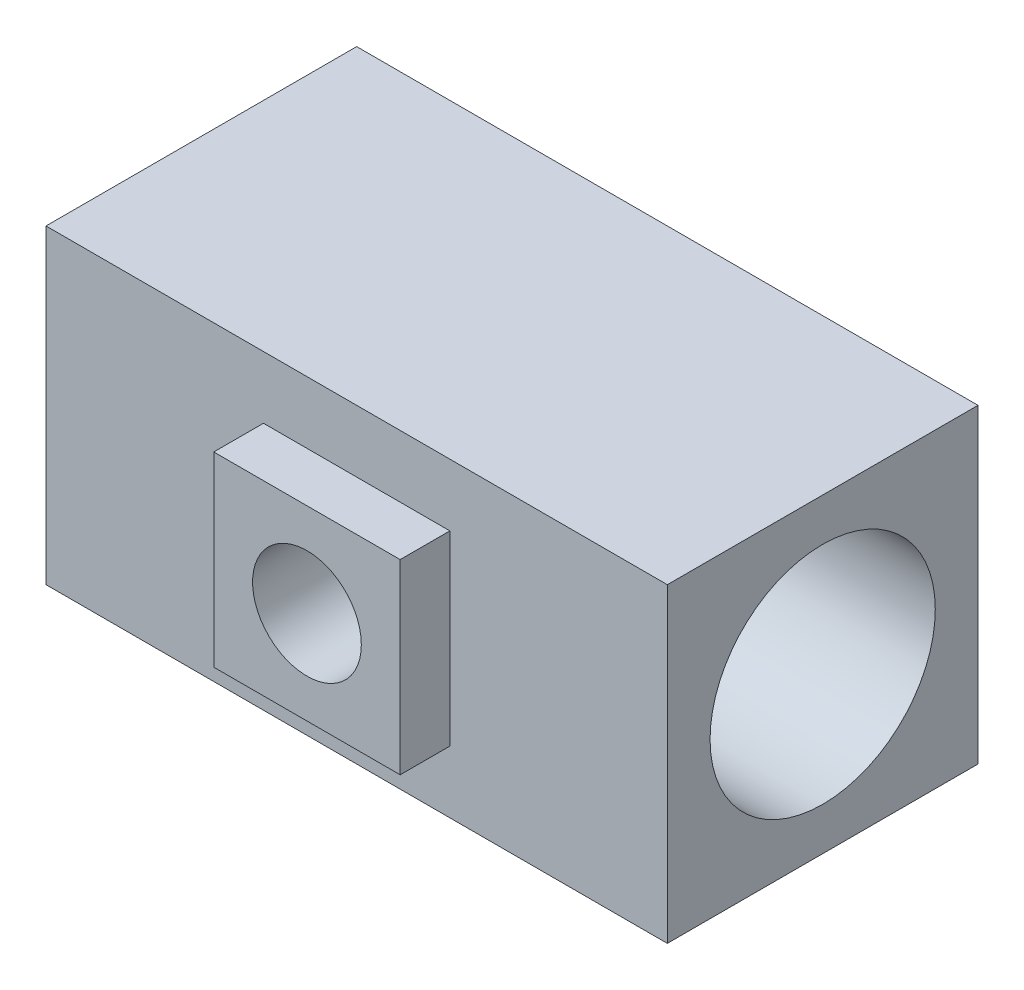
ISO-10303-21;
HEADER;
FILE_DESCRIPTION(('STEP AP214'),'2;1');
FILE_NAME('part.step','',(''),(''),'','','');
FILE_SCHEMA(('AUTOMOTIVE_DESIGN { 1 0 10303 214 1 1 1 1 }'));
ENDSEC;
DATA;
#1=APPLICATION_CONTEXT('core data for automotive mechanical design processes');
#2=APPLICATION_PROTOCOL_DEFINITION('international standard','automotive_design',2000,#1);
#3=PRODUCT_CONTEXT('',#1,'mechanical');
#4=PRODUCT('Part','Part','',(#3));
#5=PRODUCT_RELATED_PRODUCT_CATEGORY('part','',(#4));
#6=PRODUCT_DEFINITION_FORMATION('','',#4);
#7=PRODUCT_DEFINITION_CONTEXT('part definition',#1,'design');
#8=PRODUCT_DEFINITION('design','',#6,#7);
#9=PRODUCT_DEFINITION_SHAPE('','',#8);
#10=(LENGTH_UNIT() NAMED_UNIT(*) SI_UNIT(.MILLI.,.METRE.));
#11=(NAMED_UNIT(*) PLANE_ANGLE_UNIT() SI_UNIT($,.RADIAN.));
#12=(NAMED_UNIT(*) SI_UNIT($,.STERADIAN.) SOLID_ANGLE_UNIT());
#13=UNCERTAINTY_MEASURE_WITH_UNIT(LENGTH_MEASURE(1.E-05),#10,'distance_accuracy_value','');
#14=(GEOMETRIC_REPRESENTATION_CONTEXT(3) GLOBAL_UNCERTAINTY_ASSIGNED_CONTEXT((#13)) GLOBAL_UNIT_ASSIGNED_CONTEXT((#10,
#11,#12)) REPRESENTATION_CONTEXT('',''));
#15=CARTESIAN_POINT('',(0.,0.,0.));
#16=DIRECTION('',(0.,0.,1.));
#17=DIRECTION('',(1.,0.,0.));
#18=AXIS2_PLACEMENT_3D('',#15,#16,#17);
#19=CARTESIAN_POINT('',(0.,31.75,15.875));
#20=DIRECTION('',(0.,0.,-1.));
#21=DIRECTION('',(-1.,0.,0.));
#22=AXIS2_PLACEMENT_3D('',#19,#20,#21);
#23=PLANE('',#22);
#24=DIRECTION('',(1.,0.,0.));
#25=VECTOR('',#24,1.);
#26=CARTESIAN_POINT('',(0.,0.,15.875));
#27=LINE('',#26,#25);
#28=CARTESIAN_POINT('',(-31.75,0.,15.875));
#29=VERTEX_POINT('',#28);
#30=CARTESIAN_POINT('',(31.75,0.,15.875));
#31=VERTEX_POINT('',#30);
#32=EDGE_CURVE('E156',#29,#31,#27,.T.);
#33=ORIENTED_EDGE('',*,*,#32,.T.);
#34=DIRECTION('',(0.,-1.,0.));
#35=VECTOR('',#34,1.);
#36=CARTESIAN_POINT('',(31.75,31.75,15.875));
#37=LINE('',#36,#35);
#38=CARTESIAN_POINT('',(31.75,31.75,15.875));
#39=VERTEX_POINT('',#38);
#40=EDGE_CURVE('E11',#39,#31,#37,.T.);
#41=ORIENTED_EDGE('',*,*,#40,.F.);
#42=DIRECTION('',(1.,0.,0.));
#43=VECTOR('',#42,1.);
#44=CARTESIAN_POINT('',(0.,31.75,15.875));
#45=LINE('',#44,#43);
#46=CARTESIAN_POINT('',(-31.75,31.75,15.875));
#47=VERTEX_POINT('',#46);
#48=EDGE_CURVE('E157',#47,#39,#45,.T.);
#49=ORIENTED_EDGE('',*,*,#48,.F.);
#50=DIRECTION('',(0.,-1.,0.));
#51=VECTOR('',#50,1.);
#52=CARTESIAN_POINT('',(-31.75,31.75,15.875));
#53=LINE('',#52,#51);
#54=EDGE_CURVE('E173',#47,#29,#53,.T.);
#55=ORIENTED_EDGE('',*,*,#54,.T.);
#56=EDGE_LOOP('',(#33,#41,#49,#55));
#57=FACE_BOUND('',#56,.T.);
#58=DIRECTION('',(1.,0.,0.));
#59=VECTOR('',#58,1.);
#60=CARTESIAN_POINT('',(0.,6.35,15.875));
#61=LINE('',#60,#59);
#62=CARTESIAN_POINT('',(-9.525,6.35,15.875));
#63=VERTEX_POINT('',#62);
#64=CARTESIAN_POINT('',(9.525,6.35,15.875));
#65=VERTEX_POINT('',#64);
#66=EDGE_CURVE('E68',#63,#65,#61,.T.);
#67=ORIENTED_EDGE('',*,*,#66,.F.);
#68=DIRECTION('',(0.,1.,0.));
#69=VECTOR('',#68,1.);
#70=CARTESIAN_POINT('',(-9.525,0.,15.875));
#71=LINE('',#70,#69);
#72=CARTESIAN_POINT('',(-9.525,25.4,15.875));
#73=VERTEX_POINT('',#72);
#74=EDGE_CURVE('E73',#63,#73,#71,.T.);
#75=ORIENTED_EDGE('',*,*,#74,.T.);
#76=DIRECTION('',(1.,0.,0.));
#77=VECTOR('',#76,1.);
#78=CARTESIAN_POINT('',(0.,25.4,15.875));
#79=LINE('',#78,#77);
#80=CARTESIAN_POINT('',(9.525,25.4,15.875));
#81=VERTEX_POINT('',#80);
#82=EDGE_CURVE('E275',#73,#81,#79,.T.);
#83=ORIENTED_EDGE('',*,*,#82,.T.);
#84=DIRECTION('',(0.,1.,0.));
#85=VECTOR('',#84,1.);
#86=CARTESIAN_POINT('',(9.525,0.,15.875));
#87=LINE('',#86,#85);
#88=EDGE_CURVE('E264',#65,#81,#87,.T.);
#89=ORIENTED_EDGE('',*,*,#88,.F.);
#90=EDGE_LOOP('',(#67,#75,#83,#89));
#91=FACE_BOUND('',#90,.T.);
#92=ADVANCED_FACE('F47',(#57,#91),#23,.F.);
#93=CARTESIAN_POINT('',(31.75,31.75,0.));
#94=DIRECTION('',(-1.,0.,0.));
#95=DIRECTION('',(0.,0.,1.));
#96=AXIS2_PLACEMENT_3D('',#93,#94,#95);
#97=PLANE('',#96);
#98=CARTESIAN_POINT('',(31.75,15.875,0.));
#99=DIRECTION('',(1.,0.,0.));
#100=DIRECTION('',(0.,0.,-1.));
#101=AXIS2_PLACEMENT_3D('',#98,#99,#100);
#102=CIRCLE('',#101,11.509375);
#103=CARTESIAN_POINT('',(31.75,15.875,-11.509375));
#104=VERTEX_POINT('',#103);
#105=EDGE_CURVE('E142',#104,#104,#102,.T.);
#106=ORIENTED_EDGE('',*,*,#105,.F.);
#107=EDGE_LOOP('',(#106));
#108=FACE_BOUND('',#107,.T.);
#109=DIRECTION('',(0.,0.,-1.));
#110=VECTOR('',#109,1.);
#111=CARTESIAN_POINT('',(31.75,0.,0.));
#112=LINE('',#111,#110);
#113=CARTESIAN_POINT('',(31.75,0.,-15.875));
#114=VERTEX_POINT('',#113);
#115=EDGE_CURVE('E177',#31,#114,#112,.T.);
#116=ORIENTED_EDGE('',*,*,#115,.T.);
#117=DIRECTION('',(0.,-1.,0.));
#118=VECTOR('',#117,1.);
#119=CARTESIAN_POINT('',(31.75,31.75,-15.875));
#120=LINE('',#119,#118);
#121=CARTESIAN_POINT('',(31.75,31.75,-15.875));
#122=VERTEX_POINT('',#121);
#123=EDGE_CURVE('E61',#122,#114,#120,.T.);
#124=ORIENTED_EDGE('',*,*,#123,.F.);
#125=DIRECTION('',(0.,0.,-1.));
#126=VECTOR('',#125,1.);
#127=CARTESIAN_POINT('',(31.75,31.75,0.));
#128=LINE('',#127,#126);
#129=EDGE_CURVE('E161',#39,#122,#128,.T.);
#130=ORIENTED_EDGE('',*,*,#129,.F.);
#131=ORIENTED_EDGE('',*,*,#40,.T.);
#132=EDGE_LOOP('',(#116,#124,#130,#131));
#133=FACE_BOUND('',#132,.T.);
#134=ADVANCED_FACE('F200',(#108,#133),#97,.F.);
#135=CARTESIAN_POINT('',(0.,31.75,-15.875));
#136=DIRECTION('',(0.,0.,-1.));
#137=DIRECTION('',(-1.,0.,0.));
#138=AXIS2_PLACEMENT_3D('',#135,#136,#137);
#139=PLANE('',#138);
#140=DIRECTION('',(1.,0.,0.));
#141=VECTOR('',#140,1.);
#142=CARTESIAN_POINT('',(0.,0.,-15.875));
#143=LINE('',#142,#141);
#144=CARTESIAN_POINT('',(-31.75,0.,-15.875));
#145=VERTEX_POINT('',#144);
#146=EDGE_CURVE('E181',#145,#114,#143,.T.);
#147=ORIENTED_EDGE('',*,*,#146,.F.);
#148=DIRECTION('',(0.,-1.,0.));
#149=VECTOR('',#148,1.);
#150=CARTESIAN_POINT('',(-31.75,31.75,-15.875));
#151=LINE('',#150,#149);
#152=CARTESIAN_POINT('',(-31.75,31.75,-15.875));
#153=VERTEX_POINT('',#152);
#154=EDGE_CURVE('E190',#153,#145,#151,.T.);
#155=ORIENTED_EDGE('',*,*,#154,.F.);
#156=DIRECTION('',(1.,0.,0.));
#157=VECTOR('',#156,1.);
#158=CARTESIAN_POINT('',(0.,31.75,-15.875));
#159=LINE('',#158,#157);
#160=EDGE_CURVE('E165',#153,#122,#159,.T.);
#161=ORIENTED_EDGE('',*,*,#160,.T.);
#162=ORIENTED_EDGE('',*,*,#123,.T.);
#163=EDGE_LOOP('',(#147,#155,#161,#162));
#164=FACE_BOUND('',#163,.T.);
#165=ADVANCED_FACE('F197',(#164),#139,.T.);
#166=CARTESIAN_POINT('',(-31.75,31.75,0.));
#167=DIRECTION('',(-1.,0.,0.));
#168=DIRECTION('',(0.,0.,1.));
#169=AXIS2_PLACEMENT_3D('',#166,#167,#168);
#170=PLANE('',#169);
#171=CARTESIAN_POINT('',(-31.75,15.875,0.));
#172=DIRECTION('',(1.,0.,0.));
#173=DIRECTION('',(0.,0.,-1.));
#174=AXIS2_PLACEMENT_3D('',#171,#172,#173);
#175=CIRCLE('',#174,11.509375);
#176=CARTESIAN_POINT('',(-31.75,15.875,-11.509375));
#177=VERTEX_POINT('',#176);
#178=EDGE_CURVE('E147',#177,#177,#175,.T.);
#179=ORIENTED_EDGE('',*,*,#178,.T.);
#180=EDGE_LOOP('',(#179));
#181=FACE_BOUND('',#180,.T.);
#182=DIRECTION('',(0.,0.,-1.));
#183=VECTOR('',#182,1.);
#184=CARTESIAN_POINT('',(-31.75,0.,0.));
#185=LINE('',#184,#183);
#186=EDGE_CURVE('E162',#29,#145,#185,.T.);
#187=ORIENTED_EDGE('',*,*,#186,.F.);
#188=ORIENTED_EDGE('',*,*,#54,.F.);
#189=DIRECTION('',(0.,0.,-1.));
#190=VECTOR('',#189,1.);
#191=CARTESIAN_POINT('',(-31.75,31.75,0.));
#192=LINE('',#191,#190);
#193=EDGE_CURVE('E169',#47,#153,#192,.T.);
#194=ORIENTED_EDGE('',*,*,#193,.T.);
#195=ORIENTED_EDGE('',*,*,#154,.T.);
#196=EDGE_LOOP('',(#187,#188,#194,#195));
#197=FACE_BOUND('',#196,.T.);
#198=ADVANCED_FACE('F207',(#181,#197),#170,.T.);
#199=CARTESIAN_POINT('',(0.,31.75,0.));
#200=DIRECTION('',(0.,1.,0.));
#201=DIRECTION('',(0.,0.,1.));
#202=AXIS2_PLACEMENT_3D('',#199,#200,#201);
#203=PLANE('',#202);
#204=ORIENTED_EDGE('',*,*,#48,.T.);
#205=ORIENTED_EDGE('',*,*,#129,.T.);
#206=ORIENTED_EDGE('',*,*,#160,.F.);
#207=ORIENTED_EDGE('',*,*,#193,.F.);
#208=EDGE_LOOP('',(#204,#205,#206,#207));
#209=FACE_BOUND('',#208,.T.);
#210=ADVANCED_FACE('F211',(#209),#203,.T.);
#211=CARTESIAN_POINT('',(0.,0.,0.));
#212=DIRECTION('',(0.,1.,0.));
#213=DIRECTION('',(0.,0.,1.));
#214=AXIS2_PLACEMENT_3D('',#211,#212,#213);
#215=PLANE('',#214);
#216=ORIENTED_EDGE('',*,*,#32,.F.);
#217=ORIENTED_EDGE('',*,*,#186,.T.);
#218=ORIENTED_EDGE('',*,*,#146,.T.);
#219=ORIENTED_EDGE('',*,*,#115,.F.);
#220=EDGE_LOOP('',(#216,#217,#218,#219));
#221=FACE_BOUND('',#220,.T.);
#222=ADVANCED_FACE('F204',(#221),#215,.F.);
#223=CARTESIAN_POINT('',(31.75,15.875,0.));
#224=DIRECTION('',(1.,0.,0.));
#225=DIRECTION('',(0.,0.,-1.));
#226=AXIS2_PLACEMENT_3D('',#223,#224,#225);
#227=CYLINDRICAL_SURFACE('',#226,11.509375);
#228=CARTESIAN_POINT('',(5.55625,15.875,11.509375));
#229=CARTESIAN_POINT('',(5.55624917670931,16.0217161827962,11.5093742745244));
#230=CARTESIAN_POINT('',(5.55043176712709,16.1684514863056,11.5065627281438));
#231=CARTESIAN_POINT('',(5.52722532965593,16.4608490918241,11.4953867994236));
#232=CARTESIAN_POINT('',(5.50983075529338,16.6065108456735,11.4870197555197));
#233=CARTESIAN_POINT('',(5.46363405768655,16.8958379508244,11.4649327836274));
#234=CARTESIAN_POINT('',(5.43481396879573,17.0394997873948,11.4512044259401));
#235=CARTESIAN_POINT('',(5.36607781282107,17.3236196089221,11.4187421982216));
#236=CARTESIAN_POINT('',(5.32615720917637,17.464076258534,11.4000062818219));
#237=CARTESIAN_POINT('',(5.23582668542856,17.7402185894981,11.3580845669973));
#238=CARTESIAN_POINT('',(5.18546202443527,17.8759219967391,11.3349180013025));
#239=CARTESIAN_POINT('',(5.0746132703954,18.1423928013823,11.2846385897472));
#240=CARTESIAN_POINT('',(5.01412537467707,18.2731583212179,11.2575242614565));
#241=CARTESIAN_POINT('',(4.81827856523361,18.6567962075089,11.171204198503));
#242=CARTESIAN_POINT('',(4.66843156311467,18.9013275978551,11.1069709761259));
#243=CARTESIAN_POINT('',(4.32480364962457,19.3762803882592,10.9668460296091));
#244=CARTESIAN_POINT('',(4.12899135252334,19.6050810049142,10.8904962139281));
#245=CARTESIAN_POINT('',(3.70310804289293,20.0281845102496,10.7362690637281));
#246=CARTESIAN_POINT('',(3.47301301976507,20.2224630098797,10.6583906921144));
#247=CARTESIAN_POINT('',(3.09706550322224,20.490856906311,10.5437185326314));
#248=CARTESIAN_POINT('',(2.96164682087579,20.5789081286492,10.5046244939838));
#249=CARTESIAN_POINT('',(2.68303969055155,20.7431956350958,10.4295026937569));
#250=CARTESIAN_POINT('',(2.53985455771173,20.8194369075664,10.3934736404844));
#251=CARTESIAN_POINT('',(2.24653350940521,20.9594287072871,10.3257132657496));
#252=CARTESIAN_POINT('',(2.0963979044515,21.023179791873,10.2939817525424));
#253=CARTESIAN_POINT('',(1.79023246616458,21.1374763177278,10.2360228975961));
#254=CARTESIAN_POINT('',(1.63420607738184,21.188029343568,10.2097923962852));
#255=CARTESIAN_POINT('',(1.32648387367507,21.2728090952795,10.1652118787826));
#256=CARTESIAN_POINT('',(1.17505356132178,21.3078063968844,10.1464959430813));
#257=CARTESIAN_POINT('',(0.869208860627859,21.3650433875042,10.115641263073));
#258=CARTESIAN_POINT('',(0.71479604772813,21.3872896312438,10.1034991396535));
#259=CARTESIAN_POINT('',(0.40433100232894,21.4187137561491,10.0862913659061));
#260=CARTESIAN_POINT('',(0.248279649045267,21.4278983178002,10.0812220981435));
#261=CARTESIAN_POINT('',(-0.0641021623082889,21.4330753075958,10.0783690850181));
#262=CARTESIAN_POINT('',(-0.220432595712277,21.4290688489978,10.0805847248447));
#263=CARTESIAN_POINT('',(-0.514787582262235,21.4090960170049,10.0915608134673));
#264=CARTESIAN_POINT('',(-0.652935232069558,21.3944928752436,10.0995749824762));
#265=CARTESIAN_POINT('',(-0.927379883061346,21.3550644062661,10.1210232079932));
#266=CARTESIAN_POINT('',(-1.06367628328813,21.330235837873,10.134458982973));
#267=CARTESIAN_POINT('',(-1.33345991658716,21.2706348318495,10.1663158118991));
#268=CARTESIAN_POINT('',(-1.46694757494182,21.2358639114314,10.1847361051804));
#269=CARTESIAN_POINT('',(-1.73036735965916,21.1567313303141,10.225996808665));
#270=CARTESIAN_POINT('',(-1.86029807252418,21.112365917434,10.248838947781));
#271=CARTESIAN_POINT('',(-2.24952315162245,20.96320273266,10.3241730035307));
#272=CARTESIAN_POINT('',(-2.50218142559267,20.8436861921535,10.3827132068056));
#273=CARTESIAN_POINT('',(-2.98489712264919,20.5696271842136,10.5094677729022));
#274=CARTESIAN_POINT('',(-3.21494442638983,20.4150691356525,10.5776864341633));
#275=CARTESIAN_POINT('',(-3.67443472273407,20.0541711800927,10.725791278955));
#276=CARTESIAN_POINT('',(-3.90065010750817,19.8438863118393,10.8061081019085));
#277=CARTESIAN_POINT('',(-4.31596509645506,19.3877505918141,10.9628597354545));
#278=CARTESIAN_POINT('',(-4.50504920376075,19.1418849643302,11.0392929153721));
#279=CARTESIAN_POINT('',(-4.76026535090936,18.7451814958855,11.1466447726395));
#280=CARTESIAN_POINT('',(-4.84190294707575,18.6052486797592,11.1818256881973));
#281=CARTESIAN_POINT('',(-4.99297394488215,18.3180339143438,11.2480650561521));
#282=CARTESIAN_POINT('',(-5.06241245737349,18.1707550760613,11.2791252336059));
#283=CARTESIAN_POINT('',(-5.1883453158768,17.8698883876937,11.3362065187612));
#284=CARTESIAN_POINT('',(-5.24484440516823,17.7163028739094,11.3622294724437));
#285=CARTESIAN_POINT('',(-5.34425784976348,17.4039448450254,11.408459622944));
#286=CARTESIAN_POINT('',(-5.38717364828769,17.2451728829629,11.4286674375976));
#287=CARTESIAN_POINT('',(-5.45602095233257,16.9364840034257,11.4612879518407));
#288=CARTESIAN_POINT('',(-5.48302580699813,16.7868575232727,11.4741900903213));
#289=CARTESIAN_POINT('',(-5.52470046509021,16.4855151543708,11.4941627673432));
#290=CARTESIAN_POINT('',(-5.53937126096037,16.3337994347284,11.5012337750778));
#291=CARTESIAN_POINT('',(-5.55618807382354,16.0295677480296,11.5093427554344));
#292=CARTESIAN_POINT('',(-5.55833844918365,15.8770520779428,11.5103828274287));
#293=CARTESIAN_POINT('',(-5.55009766154914,15.5724426409943,11.5064055701472));
#294=CARTESIAN_POINT('',(-5.53970698297379,15.4203488580639,11.5013884748396));
#295=CARTESIAN_POINT('',(-5.50770799569872,15.1286532269732,11.4860118003834));
#296=CARTESIAN_POINT('',(-5.48695394022252,14.9889350720954,11.4760594152334));
#297=CARTESIAN_POINT('',(-5.43496904456927,14.7118566496924,11.4512953602001));
#298=CARTESIAN_POINT('',(-5.40373486504144,14.5744971484032,11.4364821415108));
#299=CARTESIAN_POINT('',(-5.33111429815479,14.3031049507264,11.4023484300071));
#300=CARTESIAN_POINT('',(-5.28973097011656,14.1690712651997,11.3830292955246));
#301=CARTESIAN_POINT('',(-5.19719866461974,13.9050665082899,11.3403262772334));
#302=CARTESIAN_POINT('',(-5.14604595046922,13.7750970136272,11.3169408384118));
#303=CARTESIAN_POINT('',(-4.97526526228489,13.3848817770465,11.2399484532559));
#304=CARTESIAN_POINT('',(-4.84043485852495,13.1322355665106,11.1805371343703));
#305=CARTESIAN_POINT('',(-4.53518458376599,12.6524131041097,11.0518139622956));
#306=CARTESIAN_POINT('',(-4.36474920052133,12.4252480202878,10.9824977979732));
#307=CARTESIAN_POINT('',(-3.97478995091778,11.9803369483628,10.83315813575));
#308=CARTESIAN_POINT('',(-3.7521764329486,11.765427289037,10.7527381857527));
#309=CARTESIAN_POINT('',(-3.27341673003243,11.3747703395995,10.5951927396217));
#310=CARTESIAN_POINT('',(-3.01725132991948,11.1990456477678,10.5180691651496));
#311=CARTESIAN_POINT('',(-2.6066293865917,10.965458575265,10.4100860394683));
#312=CARTESIAN_POINT('',(-2.46229626188337,10.891482193332,10.3747742376043));
#313=CARTESIAN_POINT('',(-2.16687413852488,10.7561201860935,10.3086590819563));
#314=CARTESIAN_POINT('',(-2.01578822507776,10.6947288811331,10.2778536962287));
#315=CARTESIAN_POINT('',(-1.7079757805328,10.5852549829649,10.221941758035));
#316=CARTESIAN_POINT('',(-1.55125357586345,10.5371624180251,10.1968309381948));
#317=CARTESIAN_POINT('',(-1.23329265055951,10.4548657207494,10.1533261373838));
#318=CARTESIAN_POINT('',(-1.0720545732824,10.4206596207178,10.134931204817));
#319=CARTESIAN_POINT('',(-0.761717566487486,10.3691774186428,10.1070471653463));
#320=CARTESIAN_POINT('',(-0.612890756313448,10.3506188374852,10.0968869227534));
#321=CARTESIAN_POINT('',(-0.313925698362231,10.3255982718127,10.0831572812686));
#322=CARTESIAN_POINT('',(-0.163787570158543,10.3191351956945,10.0795872876159));
#323=CARTESIAN_POINT('',(0.136483530582645,10.3183983480878,10.0791810483278));
#324=CARTESIAN_POINT('',(0.286616492485649,10.3241211170063,10.0823428915065));
#325=CARTESIAN_POINT('',(0.58563684120493,10.3476646599421,10.0952689889765));
#326=CARTESIAN_POINT('',(0.734524266860923,10.3654850552831,10.1050330366076));
#327=CARTESIAN_POINT('',(1.01749931869986,10.4109910872922,10.1297052039949));
#328=CARTESIAN_POINT('',(1.15178415635671,10.4377281014503,10.1441153857669));
#329=CARTESIAN_POINT('',(1.41746883751014,10.5008614763396,10.1777018617631));
#330=CARTESIAN_POINT('',(1.54886776509318,10.5372608570301,10.1968796459757));
#331=CARTESIAN_POINT('',(1.93754157022929,10.6604433169916,10.2607380055822));
#332=CARTESIAN_POINT('',(2.18947663802037,10.7612406732841,10.3117607695226));
#333=CARTESIAN_POINT('',(2.69007546576374,11.0048738554934,10.4291395000461));
#334=CARTESIAN_POINT('',(2.93738590514495,11.1500762478461,10.4962944848735));
#335=CARTESIAN_POINT('',(3.40571736098759,11.4756321473774,10.6368584817885));
#336=CARTESIAN_POINT('',(3.62672524243684,11.6560030994548,10.7102705874241));
#337=CARTESIAN_POINT('',(4.06154830948552,12.0703407406444,10.8648141713499));
#338=CARTESIAN_POINT('',(4.27188138728121,12.30802461839,10.9459039654802));
#339=CARTESIAN_POINT('',(4.55553399438264,12.6899895916608,11.0607070482151));
#340=CARTESIAN_POINT('',(4.64483792981559,12.8216710750929,11.0978641551184));
#341=CARTESIAN_POINT('',(4.81215032344455,13.0928315629359,11.1689232679138));
#342=CARTESIAN_POINT('',(4.89016397304004,13.2323069424704,11.2028267674195));
#343=CARTESIAN_POINT('',(5.03425029400513,13.5183273248093,11.2664676998002));
#344=CARTESIAN_POINT('',(5.10031478376494,13.6648770851237,11.2962022750971));
#345=CARTESIAN_POINT('',(5.21972533720667,13.9639060841525,11.3506170029584));
#346=CARTESIAN_POINT('',(5.27307762099158,14.1163823803467,11.3752996266138));
#347=CARTESIAN_POINT('',(5.36636120732754,14.4258149773538,11.4188411531494));
#348=CARTESIAN_POINT('',(5.40632276114929,14.5827602990886,11.4377131749363));
#349=CARTESIAN_POINT('',(5.47244674032604,14.9000761842849,11.4691159636703));
#350=CARTESIAN_POINT('',(5.49861796836467,15.0604444945748,11.4816507755972));
#351=CARTESIAN_POINT('',(5.53053809682022,15.330062331827,11.4969792925322));
#352=CARTESIAN_POINT('',(5.54017354912781,15.438764603652,11.5016212304839));
#353=CARTESIAN_POINT('',(5.55302988750243,15.656641046,11.5078193928603));
#354=CARTESIAN_POINT('',(5.55625061268501,15.7658152282898,11.509375539892));
#355=CARTESIAN_POINT('',(5.55625,15.875,11.509375));
#356=B_SPLINE_CURVE_WITH_KNOTS('',3,(#228,#229,#230,#231,#232,#233,#234,#235,#236,#237,#238,
#239,#240,#241,#242,#243,#244,#245,#246,#247,#248,#249,#250,#251,#252,#253,#254,#255,#256,#257,
#258,#259,#260,#261,#262,#263,#264,#265,#266,#267,#268,#269,#270,#271,#272,#273,#274,#275,#276,
#277,#278,#279,#280,#281,#282,#283,#284,#285,#286,#287,#288,#289,#290,#291,#292,#293,#294,#295,
#296,#297,#298,#299,#300,#301,#302,#303,#304,#305,#306,#307,#308,#309,#310,#311,#312,#313,#314,
#315,#316,#317,#318,#319,#320,#321,#322,#323,#324,#325,#326,#327,#328,#329,#330,#331,#332,#333,
#334,#335,#336,#337,#338,#339,#340,#341,#342,#343,#344,#345,#346,#347,#348,#349,#350,#351,#352,
#353,#354,#355),.UNSPECIFIED.,.T.,.F.,(4,2,2,2,2,2,2,2,2,2,2,2,2,2,2,2,2,2,2,2,2,2,2,2,2,2,2,2,
2,2,2,2,2,2,2,2,2,2,2,2,2,2,2,2,2,2,2,2,2,2,2,2,2,2,2,2,2,2,2,2,2,2,2,4),(0.,0.440040362554435,
0.880291694793109,1.32123804799024,1.76236487276905,2.2016186012331,2.6410377019674,
3.5188724778228,4.44720306001579,5.37618690039855,5.87423862157219,6.37207939544333,
6.86989794965314,7.36742978798151,7.8364030055191,8.30513492906855,8.77362703018528,
9.24207959387839,9.65903291521381,10.0761185010477,10.4931404731679,10.9103258286747,
11.7632747568597,12.6166036932768,13.5698940930991,14.5235815103237,15.0203733968855,
15.5169566517119,16.0133575787172,16.5097057455598,16.9668702497747,17.4239979653343,
17.8809665448997,18.3379174738513,18.7622297607783,19.186677377713,19.6109972076969,
20.0354796619695,20.9089138427864,21.7827293547615,22.7377353085697,23.6932906055866,
24.1906889846946,24.6878623909293,25.1846619867895,25.6813911621445,26.1317439144035,
26.5820560209659,27.0322402998047,27.4824104877662,27.8949694997984,28.3076576087051,
29.1324810406994,30.0126390208786,30.8932347076183,31.8709593379778,32.3606357240867,
32.8500862312346,33.3398706076821,33.8294148374232,34.3178455520473,34.8059641112104,
35.133429702592,35.4609035068655),.UNSPECIFIED.);
#357=CARTESIAN_POINT('',(5.55625,15.875,11.509375));
#358=VERTEX_POINT('',#357);
#359=EDGE_CURVE('E50',#358,#358,#356,.T.);
#360=ORIENTED_EDGE('',*,*,#359,.T.);
#361=EDGE_LOOP('',(#360));
#362=FACE_BOUND('',#361,.T.);
#363=ORIENTED_EDGE('',*,*,#178,.F.);
#364=EDGE_LOOP('',(#363));
#365=FACE_BOUND('',#364,.T.);
#366=ORIENTED_EDGE('',*,*,#105,.T.);
#367=EDGE_LOOP('',(#366));
#368=FACE_BOUND('',#367,.T.);
#369=ADVANCED_FACE('F229',(#362,#365,#368),#227,.F.);
#370=CARTESIAN_POINT('',(0.,6.35,20.955));
#371=DIRECTION('',(0.,1.,0.));
#372=DIRECTION('',(0.,0.,1.));
#373=AXIS2_PLACEMENT_3D('',#370,#371,#372);
#374=PLANE('',#373);
#375=ORIENTED_EDGE('',*,*,#66,.T.);
#376=DIRECTION('',(0.,0.,-1.));
#377=VECTOR('',#376,1.);
#378=CARTESIAN_POINT('',(9.525,6.35,20.955));
#379=LINE('',#378,#377);
#380=CARTESIAN_POINT('',(9.525,6.35,20.955));
#381=VERTEX_POINT('',#380);
#382=EDGE_CURVE('E122',#381,#65,#379,.T.);
#383=ORIENTED_EDGE('',*,*,#382,.F.);
#384=DIRECTION('',(1.,0.,0.));
#385=VECTOR('',#384,1.);
#386=CARTESIAN_POINT('',(0.,6.35,20.955));
#387=LINE('',#386,#385);
#388=CARTESIAN_POINT('',(-9.525,6.35,20.955));
#389=VERTEX_POINT('',#388);
#390=EDGE_CURVE('E130',#389,#381,#387,.T.);
#391=ORIENTED_EDGE('',*,*,#390,.F.);
#392=DIRECTION('',(0.,0.,-1.));
#393=VECTOR('',#392,1.);
#394=CARTESIAN_POINT('',(-9.525,6.35,20.955));
#395=LINE('',#394,#393);
#396=EDGE_CURVE('E271',#389,#63,#395,.T.);
#397=ORIENTED_EDGE('',*,*,#396,.T.);
#398=EDGE_LOOP('',(#375,#383,#391,#397));
#399=FACE_BOUND('',#398,.T.);
#400=ADVANCED_FACE('F140',(#399),#374,.F.);
#401=CARTESIAN_POINT('',(9.525,0.,20.955));
#402=DIRECTION('',(-1.,0.,0.));
#403=DIRECTION('',(0.,0.,1.));
#404=AXIS2_PLACEMENT_3D('',#401,#402,#403);
#405=PLANE('',#404);
#406=ORIENTED_EDGE('',*,*,#88,.T.);
#407=DIRECTION('',(0.,0.,-1.));
#408=VECTOR('',#407,1.);
#409=CARTESIAN_POINT('',(9.525,25.4,20.955));
#410=LINE('',#409,#408);
#411=CARTESIAN_POINT('',(9.525,25.4,20.955));
#412=VERTEX_POINT('',#411);
#413=EDGE_CURVE('E124',#412,#81,#410,.T.);
#414=ORIENTED_EDGE('',*,*,#413,.F.);
#415=DIRECTION('',(0.,1.,0.));
#416=VECTOR('',#415,1.);
#417=CARTESIAN_POINT('',(9.525,0.,20.955));
#418=LINE('',#417,#416);
#419=EDGE_CURVE('E117',#381,#412,#418,.T.);
#420=ORIENTED_EDGE('',*,*,#419,.F.);
#421=ORIENTED_EDGE('',*,*,#382,.T.);
#422=EDGE_LOOP('',(#406,#414,#420,#421));
#423=FACE_BOUND('',#422,.T.);
#424=ADVANCED_FACE('F120',(#423),#405,.F.);
#425=CARTESIAN_POINT('',(0.,25.4,20.955));
#426=DIRECTION('',(0.,1.,0.));
#427=DIRECTION('',(0.,0.,1.));
#428=AXIS2_PLACEMENT_3D('',#425,#426,#427);
#429=PLANE('',#428);
#430=ORIENTED_EDGE('',*,*,#82,.F.);
#431=DIRECTION('',(0.,0.,-1.));
#432=VECTOR('',#431,1.);
#433=CARTESIAN_POINT('',(-9.525,25.4,20.955));
#434=LINE('',#433,#432);
#435=CARTESIAN_POINT('',(-9.525,25.4,20.955));
#436=VERTEX_POINT('',#435);
#437=EDGE_CURVE('E149',#436,#73,#434,.T.);
#438=ORIENTED_EDGE('',*,*,#437,.F.);
#439=DIRECTION('',(1.,0.,0.));
#440=VECTOR('',#439,1.);
#441=CARTESIAN_POINT('',(0.,25.4,20.955));
#442=LINE('',#441,#440);
#443=EDGE_CURVE('E129',#436,#412,#442,.T.);
#444=ORIENTED_EDGE('',*,*,#443,.T.);
#445=ORIENTED_EDGE('',*,*,#413,.T.);
#446=EDGE_LOOP('',(#430,#438,#444,#445));
#447=FACE_BOUND('',#446,.T.);
#448=ADVANCED_FACE('F239',(#447),#429,.T.);
#449=CARTESIAN_POINT('',(-9.525,0.,20.955));
#450=DIRECTION('',(-1.,0.,0.));
#451=DIRECTION('',(0.,0.,1.));
#452=AXIS2_PLACEMENT_3D('',#449,#450,#451);
#453=PLANE('',#452);
#454=ORIENTED_EDGE('',*,*,#74,.F.);
#455=ORIENTED_EDGE('',*,*,#396,.F.);
#456=DIRECTION('',(0.,1.,0.));
#457=VECTOR('',#456,1.);
#458=CARTESIAN_POINT('',(-9.525,0.,20.955));
#459=LINE('',#458,#457);
#460=EDGE_CURVE('E136',#389,#436,#459,.T.);
#461=ORIENTED_EDGE('',*,*,#460,.T.);
#462=ORIENTED_EDGE('',*,*,#437,.T.);
#463=EDGE_LOOP('',(#454,#455,#461,#462));
#464=FACE_BOUND('',#463,.T.);
#465=ADVANCED_FACE('F242',(#464),#453,.T.);
#466=CARTESIAN_POINT('',(0.,0.,20.955));
#467=DIRECTION('',(0.,0.,1.));
#468=DIRECTION('',(1.,0.,0.));
#469=AXIS2_PLACEMENT_3D('',#466,#467,#468);
#470=PLANE('',#469);
#471=CARTESIAN_POINT('',(0.,15.875,20.955));
#472=DIRECTION('',(0.,0.,1.));
#473=DIRECTION('',(1.,0.,0.));
#474=AXIS2_PLACEMENT_3D('',#471,#472,#473);
#475=CIRCLE('',#474,5.55625);
#476=CARTESIAN_POINT('',(5.55625,15.875,20.955));
#477=VERTEX_POINT('',#476);
#478=EDGE_CURVE('E258',#477,#477,#475,.T.);
#479=ORIENTED_EDGE('',*,*,#478,.F.);
#480=EDGE_LOOP('',(#479));
#481=FACE_BOUND('',#480,.T.);
#482=ORIENTED_EDGE('',*,*,#390,.T.);
#483=ORIENTED_EDGE('',*,*,#419,.T.);
#484=ORIENTED_EDGE('',*,*,#443,.F.);
#485=ORIENTED_EDGE('',*,*,#460,.F.);
#486=EDGE_LOOP('',(#482,#483,#484,#485));
#487=FACE_BOUND('',#486,.T.);
#488=ADVANCED_FACE('F134',(#481,#487),#470,.T.);
#489=CARTESIAN_POINT('',(0.,15.875,20.955));
#490=DIRECTION('',(0.,0.,1.));
#491=DIRECTION('',(1.,0.,0.));
#492=AXIS2_PLACEMENT_3D('',#489,#490,#491);
#493=CYLINDRICAL_SURFACE('',#492,5.55625);
#494=ORIENTED_EDGE('',*,*,#478,.T.);
#495=EDGE_LOOP('',(#494));
#496=FACE_BOUND('',#495,.T.);
#497=ORIENTED_EDGE('',*,*,#359,.F.);
#498=EDGE_LOOP('',(#497));
#499=FACE_BOUND('',#498,.T.);
#500=ADVANCED_FACE('F248',(#496,#499),#493,.F.);
#501=CLOSED_SHELL('',(#92,#134,#165,#198,#210,#222,#369,#400,#424,#448,#465,#488,#500));
#502=MANIFOLD_SOLID_BREP('B2',#501);
#503=ADVANCED_BREP_SHAPE_REPRESENTATION('',(#18,#502),#14);
#504=SHAPE_DEFINITION_REPRESENTATION(#9,#503);
ENDSEC;
END-ISO-10303-21;
